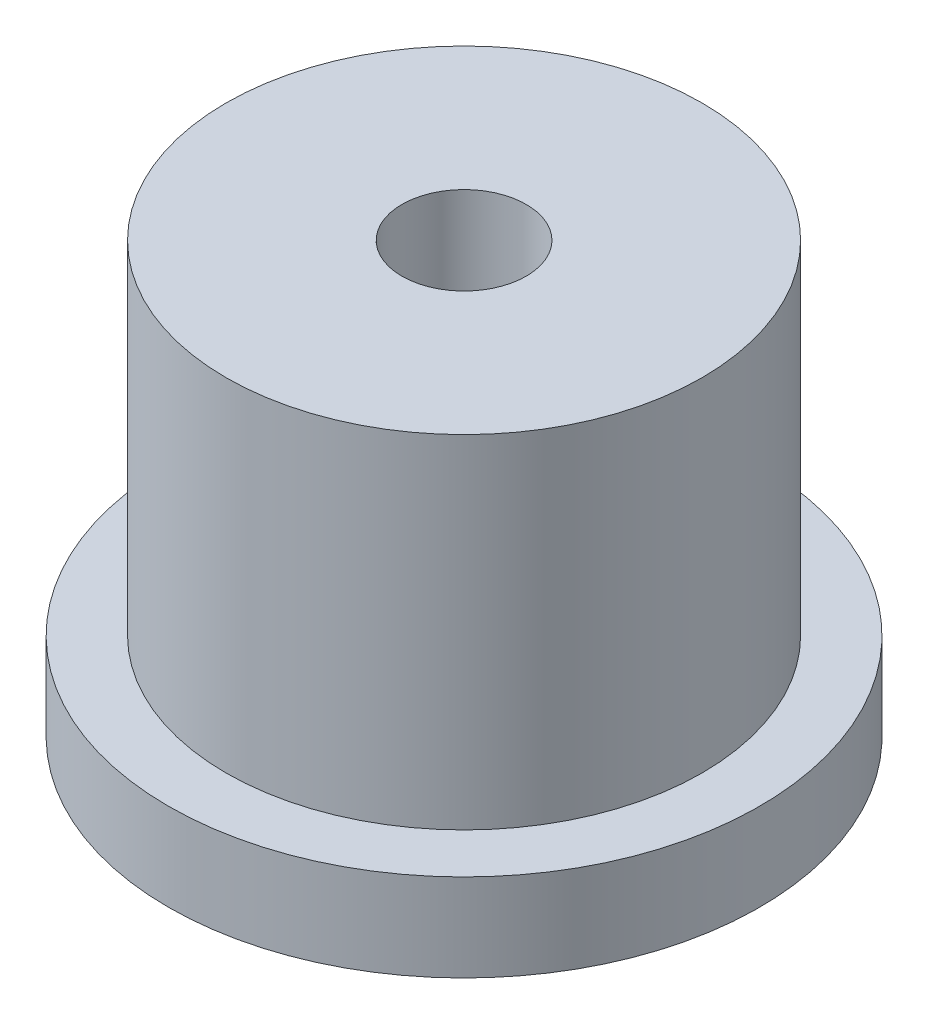
ISO-10303-21;
HEADER;
FILE_DESCRIPTION(('STEP AP214'),'2;1');
FILE_NAME('part.step','',(''),(''),'','','');
FILE_SCHEMA(('AUTOMOTIVE_DESIGN { 1 0 10303 214 1 1 1 1 }'));
ENDSEC;
DATA;
#1=APPLICATION_CONTEXT('core data for automotive mechanical design processes');
#2=APPLICATION_PROTOCOL_DEFINITION('international standard','automotive_design',2000,#1);
#3=PRODUCT_CONTEXT('',#1,'mechanical');
#4=PRODUCT('Part','Part','',(#3));
#5=PRODUCT_RELATED_PRODUCT_CATEGORY('part','',(#4));
#6=PRODUCT_DEFINITION_FORMATION('','',#4);
#7=PRODUCT_DEFINITION_CONTEXT('part definition',#1,'design');
#8=PRODUCT_DEFINITION('design','',#6,#7);
#9=PRODUCT_DEFINITION_SHAPE('','',#8);
#10=(LENGTH_UNIT() NAMED_UNIT(*) SI_UNIT(.MILLI.,.METRE.));
#11=(NAMED_UNIT(*) PLANE_ANGLE_UNIT() SI_UNIT($,.RADIAN.));
#12=(NAMED_UNIT(*) SI_UNIT($,.STERADIAN.) SOLID_ANGLE_UNIT());
#13=UNCERTAINTY_MEASURE_WITH_UNIT(LENGTH_MEASURE(1.E-05),#10,'distance_accuracy_value','');
#14=(GEOMETRIC_REPRESENTATION_CONTEXT(3) GLOBAL_UNCERTAINTY_ASSIGNED_CONTEXT((#13)) GLOBAL_UNIT_ASSIGNED_CONTEXT((#10,
#11,#12)) REPRESENTATION_CONTEXT('',''));
#15=CARTESIAN_POINT('',(0.,0.,0.));
#16=DIRECTION('',(0.,0.,1.));
#17=DIRECTION('',(1.,0.,0.));
#18=AXIS2_PLACEMENT_3D('',#15,#16,#17);
#19=CARTESIAN_POINT('',(0.,0.,0.));
#20=DIRECTION('',(0.,-1.,0.));
#21=DIRECTION('',(0.,0.,-1.));
#22=AXIS2_PLACEMENT_3D('',#19,#20,#21);
#23=CYLINDRICAL_SURFACE('',#22,2.38125);
#24=CARTESIAN_POINT('',(0.,2.032,0.));
#25=DIRECTION('',(0.,-1.,0.));
#26=DIRECTION('',(0.,0.,-1.));
#27=AXIS2_PLACEMENT_3D('',#24,#25,#26);
#28=CIRCLE('',#27,2.38125);
#29=CARTESIAN_POINT('',(0.,2.032,-2.38125));
#30=VERTEX_POINT('',#29);
#31=EDGE_CURVE('E17',#30,#30,#28,.T.);
#32=ORIENTED_EDGE('',*,*,#31,.F.);
#33=EDGE_LOOP('',(#32));
#34=FACE_BOUND('',#33,.T.);
#35=CARTESIAN_POINT('',(0.,0.,0.));
#36=DIRECTION('',(0.,-1.,0.));
#37=DIRECTION('',(0.,0.,-1.));
#38=AXIS2_PLACEMENT_3D('',#35,#36,#37);
#39=CIRCLE('',#38,2.38125);
#40=CARTESIAN_POINT('',(0.,0.,-2.38125));
#41=VERTEX_POINT('',#40);
#42=EDGE_CURVE('E39',#41,#41,#39,.T.);
#43=ORIENTED_EDGE('',*,*,#42,.T.);
#44=EDGE_LOOP('',(#43));
#45=FACE_BOUND('',#44,.T.);
#46=ADVANCED_FACE('F14',(#34,#45),#23,.F.);
#47=CARTESIAN_POINT('',(0.,2.032,0.));
#48=DIRECTION('',(0.,-1.,0.));
#49=DIRECTION('',(0.,0.,-1.));
#50=AXIS2_PLACEMENT_3D('',#47,#48,#49);
#51=PLANE('',#50);
#52=CARTESIAN_POINT('',(0.,2.032,0.));
#53=DIRECTION('',(0.,1.,0.));
#54=DIRECTION('',(0.,0.,1.));
#55=AXIS2_PLACEMENT_3D('',#52,#53,#54);
#56=CIRCLE('',#55,1.0287);
#57=CARTESIAN_POINT('',(0.,2.032,1.0287));
#58=VERTEX_POINT('',#57);
#59=EDGE_CURVE('E37',#58,#58,#56,.T.);
#60=ORIENTED_EDGE('',*,*,#59,.T.);
#61=EDGE_LOOP('',(#60));
#62=FACE_BOUND('',#61,.T.);
#63=ORIENTED_EDGE('',*,*,#31,.T.);
#64=EDGE_LOOP('',(#63));
#65=FACE_BOUND('',#64,.T.);
#66=ADVANCED_FACE('F46',(#62,#65),#51,.T.);
#67=CARTESIAN_POINT('',(0.,0.,0.));
#68=DIRECTION('',(0.,1.,0.));
#69=DIRECTION('',(0.,0.,1.));
#70=AXIS2_PLACEMENT_3D('',#67,#68,#69);
#71=PLANE('',#70);
#72=ORIENTED_EDGE('',*,*,#42,.F.);
#73=EDGE_LOOP('',(#72));
#74=FACE_BOUND('',#73,.T.);
#75=CARTESIAN_POINT('',(0.,0.,0.));
#76=DIRECTION('',(0.,1.,0.));
#77=DIRECTION('',(0.,0.,1.));
#78=AXIS2_PLACEMENT_3D('',#75,#76,#77);
#79=CIRCLE('',#78,4.8895);
#80=CARTESIAN_POINT('',(0.,0.,4.8895));
#81=VERTEX_POINT('',#80);
#82=EDGE_CURVE('E34',#81,#81,#79,.T.);
#83=ORIENTED_EDGE('',*,*,#82,.F.);
#84=EDGE_LOOP('',(#83));
#85=FACE_BOUND('',#84,.T.);
#86=ADVANCED_FACE('F53',(#74,#85),#71,.F.);
#87=CARTESIAN_POINT('',(0.,0.,0.));
#88=DIRECTION('',(0.,1.,0.));
#89=DIRECTION('',(0.,0.,1.));
#90=AXIS2_PLACEMENT_3D('',#87,#88,#89);
#91=CYLINDRICAL_SURFACE('',#90,1.0287);
#92=CARTESIAN_POINT('',(0.,7.112,0.));
#93=DIRECTION('',(0.,1.,0.));
#94=DIRECTION('',(0.,0.,1.));
#95=AXIS2_PLACEMENT_3D('',#92,#93,#94);
#96=CIRCLE('',#95,1.0287);
#97=CARTESIAN_POINT('',(0.,7.112,1.0287));
#98=VERTEX_POINT('',#97);
#99=EDGE_CURVE('E31',#98,#98,#96,.F.);
#100=ORIENTED_EDGE('',*,*,#99,.F.);
#101=EDGE_LOOP('',(#100));
#102=FACE_BOUND('',#101,.T.);
#103=ORIENTED_EDGE('',*,*,#59,.F.);
#104=EDGE_LOOP('',(#103));
#105=FACE_BOUND('',#104,.T.);
#106=ADVANCED_FACE('F73',(#102,#105),#91,.F.);
#107=CARTESIAN_POINT('',(0.,0.,0.));
#108=DIRECTION('',(0.,1.,0.));
#109=DIRECTION('',(0.,0.,1.));
#110=AXIS2_PLACEMENT_3D('',#107,#108,#109);
#111=CYLINDRICAL_SURFACE('',#110,4.8895);
#112=CARTESIAN_POINT('',(0.,1.4478,0.));
#113=DIRECTION('',(0.,1.,0.));
#114=DIRECTION('',(0.,0.,1.));
#115=AXIS2_PLACEMENT_3D('',#112,#113,#114);
#116=CIRCLE('',#115,4.8895);
#117=CARTESIAN_POINT('',(0.,1.4478,4.8895));
#118=VERTEX_POINT('',#117);
#119=EDGE_CURVE('E26',#118,#118,#116,.T.);
#120=ORIENTED_EDGE('',*,*,#119,.F.);
#121=EDGE_LOOP('',(#120));
#122=FACE_BOUND('',#121,.T.);
#123=ORIENTED_EDGE('',*,*,#82,.T.);
#124=EDGE_LOOP('',(#123));
#125=FACE_BOUND('',#124,.T.);
#126=ADVANCED_FACE('F69',(#122,#125),#111,.T.);
#127=CARTESIAN_POINT('',(0.,7.112,0.));
#128=DIRECTION('',(0.,1.,0.));
#129=DIRECTION('',(0.,0.,1.));
#130=AXIS2_PLACEMENT_3D('',#127,#128,#129);
#131=PLANE('',#130);
#132=ORIENTED_EDGE('',*,*,#99,.T.);
#133=EDGE_LOOP('',(#132));
#134=FACE_BOUND('',#133,.T.);
#135=CARTESIAN_POINT('',(0.,7.112,0.));
#136=DIRECTION('',(0.,1.,0.));
#137=DIRECTION('',(0.,0.,1.));
#138=AXIS2_PLACEMENT_3D('',#135,#136,#137);
#139=CIRCLE('',#138,3.937);
#140=CARTESIAN_POINT('',(0.,7.112,3.937));
#141=VERTEX_POINT('',#140);
#142=EDGE_CURVE('E21',#141,#141,#139,.F.);
#143=ORIENTED_EDGE('',*,*,#142,.F.);
#144=EDGE_LOOP('',(#143));
#145=FACE_BOUND('',#144,.T.);
#146=ADVANCED_FACE('F63',(#134,#145),#131,.T.);
#147=CARTESIAN_POINT('',(0.,1.4478,0.));
#148=DIRECTION('',(0.,1.,0.));
#149=DIRECTION('',(0.,0.,1.));
#150=AXIS2_PLACEMENT_3D('',#147,#148,#149);
#151=PLANE('',#150);
#152=CARTESIAN_POINT('',(0.,1.4478,0.));
#153=DIRECTION('',(0.,1.,0.));
#154=DIRECTION('',(0.,0.,1.));
#155=AXIS2_PLACEMENT_3D('',#152,#153,#154);
#156=CIRCLE('',#155,3.937);
#157=CARTESIAN_POINT('',(0.,1.4478,3.937));
#158=VERTEX_POINT('',#157);
#159=EDGE_CURVE('E10',#158,#158,#156,.T.);
#160=ORIENTED_EDGE('',*,*,#159,.F.);
#161=EDGE_LOOP('',(#160));
#162=FACE_BOUND('',#161,.T.);
#163=ORIENTED_EDGE('',*,*,#119,.T.);
#164=EDGE_LOOP('',(#163));
#165=FACE_BOUND('',#164,.T.);
#166=ADVANCED_FACE('F57',(#162,#165),#151,.T.);
#167=CARTESIAN_POINT('',(0.,0.,0.));
#168=DIRECTION('',(0.,1.,0.));
#169=DIRECTION('',(0.,0.,1.));
#170=AXIS2_PLACEMENT_3D('',#167,#168,#169);
#171=CYLINDRICAL_SURFACE('',#170,3.937);
#172=ORIENTED_EDGE('',*,*,#142,.T.);
#173=EDGE_LOOP('',(#172));
#174=FACE_BOUND('',#173,.T.);
#175=ORIENTED_EDGE('',*,*,#159,.T.);
#176=EDGE_LOOP('',(#175));
#177=FACE_BOUND('',#176,.T.);
#178=ADVANCED_FACE('F55',(#174,#177),#171,.T.);
#179=CLOSED_SHELL('',(#46,#66,#86,#106,#126,#146,#166,#178));
#180=MANIFOLD_SOLID_BREP('B1',#179);
#181=ADVANCED_BREP_SHAPE_REPRESENTATION('',(#18,#180),#14);
#182=SHAPE_DEFINITION_REPRESENTATION(#9,#181);
ENDSEC;
END-ISO-10303-21;
